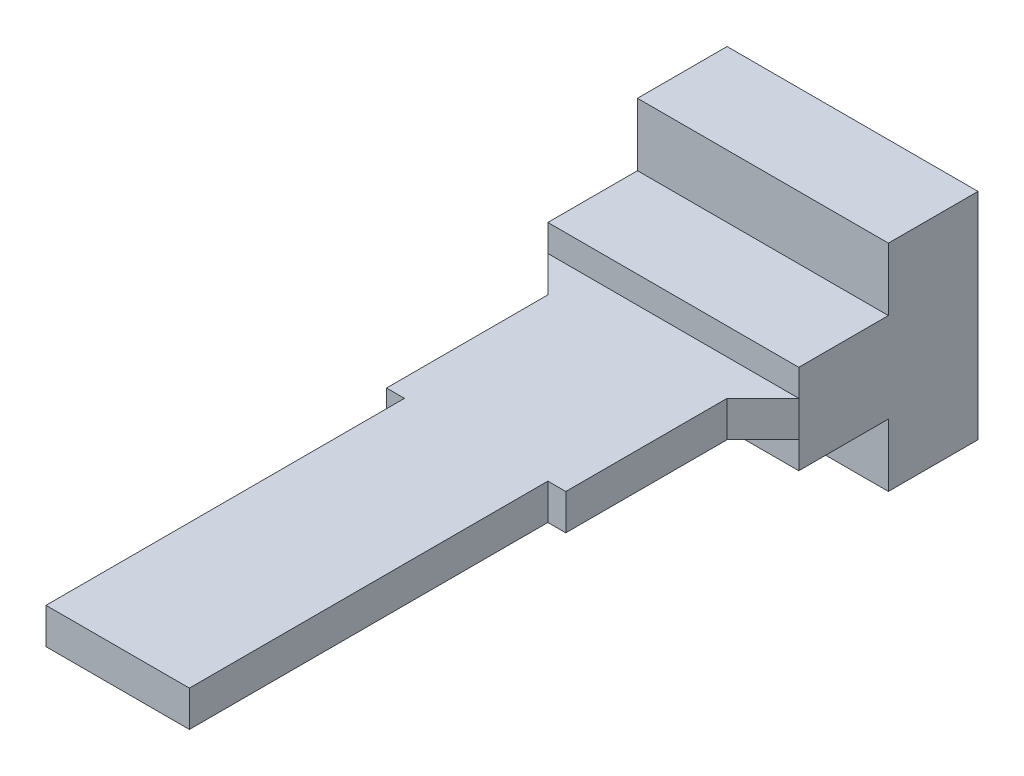
ISO-10303-21;
HEADER;
FILE_DESCRIPTION(('STEP AP214'),'2;1');
FILE_NAME('part.step','',(''),(''),'','','');
FILE_SCHEMA(('AUTOMOTIVE_DESIGN { 1 0 10303 214 1 1 1 1 }'));
ENDSEC;
DATA;
#1=APPLICATION_CONTEXT('core data for automotive mechanical design processes');
#2=APPLICATION_PROTOCOL_DEFINITION('international standard','automotive_design',2000,#1);
#3=PRODUCT_CONTEXT('',#1,'mechanical');
#4=PRODUCT('Part','Part','',(#3));
#5=PRODUCT_RELATED_PRODUCT_CATEGORY('part','',(#4));
#6=PRODUCT_DEFINITION_FORMATION('','',#4);
#7=PRODUCT_DEFINITION_CONTEXT('part definition',#1,'design');
#8=PRODUCT_DEFINITION('design','',#6,#7);
#9=PRODUCT_DEFINITION_SHAPE('','',#8);
#10=(LENGTH_UNIT() NAMED_UNIT(*) SI_UNIT(.MILLI.,.METRE.));
#11=(NAMED_UNIT(*) PLANE_ANGLE_UNIT() SI_UNIT($,.RADIAN.));
#12=(NAMED_UNIT(*) SI_UNIT($,.STERADIAN.) SOLID_ANGLE_UNIT());
#13=UNCERTAINTY_MEASURE_WITH_UNIT(LENGTH_MEASURE(1.E-05),#10,'distance_accuracy_value','');
#14=(GEOMETRIC_REPRESENTATION_CONTEXT(3) GLOBAL_UNCERTAINTY_ASSIGNED_CONTEXT((#13)) GLOBAL_UNIT_ASSIGNED_CONTEXT((#10,
#11,#12)) REPRESENTATION_CONTEXT('',''));
#15=CARTESIAN_POINT('',(0.,0.,0.));
#16=DIRECTION('',(0.,0.,1.));
#17=DIRECTION('',(1.,0.,0.));
#18=AXIS2_PLACEMENT_3D('',#15,#16,#17);
#19=CARTESIAN_POINT('',(0.,0.,10.5));
#20=DIRECTION('',(0.,0.,1.));
#21=DIRECTION('',(1.,0.,0.));
#22=AXIS2_PLACEMENT_3D('',#19,#20,#21);
#23=PLANE('',#22);
#24=DIRECTION('',(0.,-1.,0.));
#25=VECTOR('',#24,1.);
#26=CARTESIAN_POINT('',(-2.,-0.5,10.5));
#27=LINE('',#26,#25);
#28=CARTESIAN_POINT('',(-2.,0.5,10.5));
#29=VERTEX_POINT('',#28);
#30=CARTESIAN_POINT('',(-2.,-0.5,10.5));
#31=VERTEX_POINT('',#30);
#32=EDGE_CURVE('E55',#29,#31,#27,.T.);
#33=ORIENTED_EDGE('',*,*,#32,.F.);
#34=DIRECTION('',(-1.,0.,0.));
#35=VECTOR('',#34,1.);
#36=CARTESIAN_POINT('',(2.5,0.5,10.5));
#37=LINE('',#36,#35);
#38=CARTESIAN_POINT('',(-2.5,0.5,10.5));
#39=VERTEX_POINT('',#38);
#40=EDGE_CURVE('E211',#29,#39,#37,.T.);
#41=ORIENTED_EDGE('',*,*,#40,.T.);
#42=DIRECTION('',(0.,-1.,0.));
#43=VECTOR('',#42,1.);
#44=CARTESIAN_POINT('',(-2.5,-0.5,10.5));
#45=LINE('',#44,#43);
#46=CARTESIAN_POINT('',(-2.5,-0.5,10.5));
#47=VERTEX_POINT('',#46);
#48=EDGE_CURVE('E200',#39,#47,#45,.T.);
#49=ORIENTED_EDGE('',*,*,#48,.T.);
#50=DIRECTION('',(1.,0.,0.));
#51=VECTOR('',#50,1.);
#52=CARTESIAN_POINT('',(2.5,-0.5,10.5));
#53=LINE('',#52,#51);
#54=EDGE_CURVE('E205',#47,#31,#53,.T.);
#55=ORIENTED_EDGE('',*,*,#54,.T.);
#56=EDGE_LOOP('',(#33,#41,#49,#55));
#57=FACE_BOUND('',#56,.T.);
#58=ADVANCED_FACE('F39',(#57),#23,.T.);
#59=CARTESIAN_POINT('',(0.,0.,5.));
#60=DIRECTION('',(0.,0.,-1.));
#61=DIRECTION('',(-1.,0.,0.));
#62=AXIS2_PLACEMENT_3D('',#59,#60,#61);
#63=PLANE('',#62);
#64=DIRECTION('',(-1.,0.,0.));
#65=VECTOR('',#64,1.);
#66=CARTESIAN_POINT('',(3.5,0.5,5.));
#67=LINE('',#66,#65);
#68=CARTESIAN_POINT('',(3.5,0.5,5.));
#69=VERTEX_POINT('',#68);
#70=CARTESIAN_POINT('',(-3.5,0.5,5.));
#71=VERTEX_POINT('',#70);
#72=EDGE_CURVE('E237',#69,#71,#67,.T.);
#73=ORIENTED_EDGE('',*,*,#72,.F.);
#74=DIRECTION('',(0.,1.,0.));
#75=VECTOR('',#74,1.);
#76=CARTESIAN_POINT('',(3.5,-1.25,5.));
#77=LINE('',#76,#75);
#78=CARTESIAN_POINT('',(3.5,1.25,5.));
#79=VERTEX_POINT('',#78);
#80=EDGE_CURVE('E247',#69,#79,#77,.T.);
#81=ORIENTED_EDGE('',*,*,#80,.T.);
#82=DIRECTION('',(-1.,0.,0.));
#83=VECTOR('',#82,1.);
#84=CARTESIAN_POINT('',(-3.5,1.25,5.));
#85=LINE('',#84,#83);
#86=CARTESIAN_POINT('',(-3.5,1.25,5.));
#87=VERTEX_POINT('',#86);
#88=EDGE_CURVE('E246',#79,#87,#85,.T.);
#89=ORIENTED_EDGE('',*,*,#88,.T.);
#90=DIRECTION('',(0.,-1.,0.));
#91=VECTOR('',#90,1.);
#92=CARTESIAN_POINT('',(-3.5,-1.25,5.));
#93=LINE('',#92,#91);
#94=EDGE_CURVE('E251',#87,#71,#93,.T.);
#95=ORIENTED_EDGE('',*,*,#94,.T.);
#96=EDGE_LOOP('',(#73,#81,#89,#95));
#97=FACE_BOUND('',#96,.T.);
#98=ADVANCED_FACE('F354',(#97),#63,.F.);
#99=DIRECTION('',(1.,0.,0.));
#100=VECTOR('',#99,1.);
#101=CARTESIAN_POINT('',(3.5,-0.5,5.));
#102=LINE('',#101,#100);
#103=CARTESIAN_POINT('',(-3.5,-0.5,5.));
#104=VERTEX_POINT('',#103);
#105=CARTESIAN_POINT('',(3.5,-0.5,5.));
#106=VERTEX_POINT('',#105);
#107=EDGE_CURVE('E234',#104,#106,#102,.T.);
#108=ORIENTED_EDGE('',*,*,#107,.F.);
#109=CARTESIAN_POINT('',(-3.5,-1.25,5.));
#110=VERTEX_POINT('',#109);
#111=EDGE_CURVE('E250',#104,#110,#93,.T.);
#112=ORIENTED_EDGE('',*,*,#111,.T.);
#113=DIRECTION('',(1.,0.,0.));
#114=VECTOR('',#113,1.);
#115=CARTESIAN_POINT('',(-3.5,-1.25,5.));
#116=LINE('',#115,#114);
#117=CARTESIAN_POINT('',(3.5,-1.25,5.));
#118=VERTEX_POINT('',#117);
#119=EDGE_CURVE('E255',#110,#118,#116,.T.);
#120=ORIENTED_EDGE('',*,*,#119,.T.);
#121=EDGE_CURVE('E242',#118,#106,#77,.T.);
#122=ORIENTED_EDGE('',*,*,#121,.T.);
#123=EDGE_LOOP('',(#108,#112,#120,#122));
#124=FACE_BOUND('',#123,.T.);
#125=ADVANCED_FACE('F392',(#124),#63,.F.);
#126=CARTESIAN_POINT('',(0.,0.,2.5));
#127=DIRECTION('',(0.,0.,-1.));
#128=DIRECTION('',(-1.,0.,0.));
#129=AXIS2_PLACEMENT_3D('',#126,#127,#128);
#130=PLANE('',#129);
#131=DIRECTION('',(1.,0.,0.));
#132=VECTOR('',#131,1.);
#133=CARTESIAN_POINT('',(-3.5,-1.25,2.5));
#134=LINE('',#133,#132);
#135=CARTESIAN_POINT('',(-3.5,-1.25,2.5));
#136=VERTEX_POINT('',#135);
#137=CARTESIAN_POINT('',(3.5,-1.25,2.5));
#138=VERTEX_POINT('',#137);
#139=EDGE_CURVE('E262',#136,#138,#134,.T.);
#140=ORIENTED_EDGE('',*,*,#139,.F.);
#141=DIRECTION('',(0.,-1.,0.));
#142=VECTOR('',#141,1.);
#143=CARTESIAN_POINT('',(-3.5,-3.,2.5));
#144=LINE('',#143,#142);
#145=CARTESIAN_POINT('',(-3.5,-3.,2.5));
#146=VERTEX_POINT('',#145);
#147=EDGE_CURVE('E289',#136,#146,#144,.T.);
#148=ORIENTED_EDGE('',*,*,#147,.T.);
#149=DIRECTION('',(1.,0.,0.));
#150=VECTOR('',#149,1.);
#151=CARTESIAN_POINT('',(-3.5,-3.,2.5));
#152=LINE('',#151,#150);
#153=CARTESIAN_POINT('',(3.5,-3.,2.5));
#154=VERTEX_POINT('',#153);
#155=EDGE_CURVE('E293',#146,#154,#152,.T.);
#156=ORIENTED_EDGE('',*,*,#155,.T.);
#157=DIRECTION('',(0.,1.,0.));
#158=VECTOR('',#157,1.);
#159=CARTESIAN_POINT('',(3.5,-3.,2.5));
#160=LINE('',#159,#158);
#161=EDGE_CURVE('E282',#154,#138,#160,.T.);
#162=ORIENTED_EDGE('',*,*,#161,.T.);
#163=EDGE_LOOP('',(#140,#148,#156,#162));
#164=FACE_BOUND('',#163,.T.);
#165=ADVANCED_FACE('F434',(#164),#130,.F.);
#166=DIRECTION('',(-1.,0.,0.));
#167=VECTOR('',#166,1.);
#168=CARTESIAN_POINT('',(-3.5,1.25,2.5));
#169=LINE('',#168,#167);
#170=CARTESIAN_POINT('',(3.5,1.25,2.5));
#171=VERTEX_POINT('',#170);
#172=CARTESIAN_POINT('',(-3.5,1.25,2.5));
#173=VERTEX_POINT('',#172);
#174=EDGE_CURVE('E241',#171,#173,#169,.T.);
#175=ORIENTED_EDGE('',*,*,#174,.F.);
#176=CARTESIAN_POINT('',(3.5,3.,2.5));
#177=VERTEX_POINT('',#176);
#178=EDGE_CURVE('E286',#171,#177,#160,.T.);
#179=ORIENTED_EDGE('',*,*,#178,.T.);
#180=DIRECTION('',(-1.,0.,0.));
#181=VECTOR('',#180,1.);
#182=CARTESIAN_POINT('',(-3.5,3.,2.5));
#183=LINE('',#182,#181);
#184=CARTESIAN_POINT('',(-3.5,3.,2.5));
#185=VERTEX_POINT('',#184);
#186=EDGE_CURVE('E285',#177,#185,#183,.T.);
#187=ORIENTED_EDGE('',*,*,#186,.T.);
#188=EDGE_CURVE('E290',#185,#173,#144,.T.);
#189=ORIENTED_EDGE('',*,*,#188,.T.);
#190=EDGE_LOOP('',(#175,#179,#187,#189));
#191=FACE_BOUND('',#190,.T.);
#192=ADVANCED_FACE('F437',(#191),#130,.F.);
#193=CARTESIAN_POINT('',(3.5,-3.,2.5));
#194=DIRECTION('',(-1.,0.,0.));
#195=DIRECTION('',(0.,0.,1.));
#196=AXIS2_PLACEMENT_3D('',#193,#194,#195);
#197=PLANE('',#196);
#198=ORIENTED_EDGE('',*,*,#80,.F.);
#199=DIRECTION('',(0.,-1.,0.));
#200=VECTOR('',#199,1.);
#201=CARTESIAN_POINT('',(3.5,-0.5,5.));
#202=LINE('',#201,#200);
#203=EDGE_CURVE('E330',#69,#106,#202,.T.);
#204=ORIENTED_EDGE('',*,*,#203,.T.);
#205=ORIENTED_EDGE('',*,*,#121,.F.);
#206=DIRECTION('',(0.,0.,-1.));
#207=VECTOR('',#206,1.);
#208=CARTESIAN_POINT('',(3.5,-1.25,5.));
#209=LINE('',#208,#207);
#210=EDGE_CURVE('E258',#118,#138,#209,.T.);
#211=ORIENTED_EDGE('',*,*,#210,.T.);
#212=ORIENTED_EDGE('',*,*,#161,.F.);
#213=DIRECTION('',(0.,0.,-1.));
#214=VECTOR('',#213,1.);
#215=CARTESIAN_POINT('',(3.5,-3.,2.5));
#216=LINE('',#215,#214);
#217=CARTESIAN_POINT('',(3.5,-3.,0.));
#218=VERTEX_POINT('',#217);
#219=EDGE_CURVE('E296',#154,#218,#216,.T.);
#220=ORIENTED_EDGE('',*,*,#219,.T.);
#221=DIRECTION('',(0.,1.,0.));
#222=VECTOR('',#221,1.);
#223=CARTESIAN_POINT('',(3.5,-3.,0.));
#224=LINE('',#223,#222);
#225=CARTESIAN_POINT('',(3.5,3.,0.));
#226=VERTEX_POINT('',#225);
#227=EDGE_CURVE('E281',#218,#226,#224,.T.);
#228=ORIENTED_EDGE('',*,*,#227,.T.);
#229=DIRECTION('',(0.,0.,-1.));
#230=VECTOR('',#229,1.);
#231=CARTESIAN_POINT('',(3.5,3.,2.5));
#232=LINE('',#231,#230);
#233=EDGE_CURVE('E320',#177,#226,#232,.T.);
#234=ORIENTED_EDGE('',*,*,#233,.F.);
#235=ORIENTED_EDGE('',*,*,#178,.F.);
#236=DIRECTION('',(0.,0.,-1.));
#237=VECTOR('',#236,1.);
#238=CARTESIAN_POINT('',(3.5,1.25,5.));
#239=LINE('',#238,#237);
#240=EDGE_CURVE('E277',#79,#171,#239,.T.);
#241=ORIENTED_EDGE('',*,*,#240,.F.);
#242=EDGE_LOOP('',(#198,#204,#205,#211,#212,#220,#228,#234,#235,#241));
#243=FACE_BOUND('',#242,.T.);
#244=ADVANCED_FACE('F359',(#243),#197,.F.);
#245=CARTESIAN_POINT('',(-3.5,3.,2.5));
#246=DIRECTION('',(0.,-1.,0.));
#247=DIRECTION('',(0.,0.,-1.));
#248=AXIS2_PLACEMENT_3D('',#245,#246,#247);
#249=PLANE('',#248);
#250=DIRECTION('',(-1.,0.,0.));
#251=VECTOR('',#250,1.);
#252=CARTESIAN_POINT('',(-3.5,3.,0.));
#253=LINE('',#252,#251);
#254=CARTESIAN_POINT('',(-3.5,3.,0.));
#255=VERTEX_POINT('',#254);
#256=EDGE_CURVE('E300',#226,#255,#253,.T.);
#257=ORIENTED_EDGE('',*,*,#256,.T.);
#258=DIRECTION('',(0.,0.,-1.));
#259=VECTOR('',#258,1.);
#260=CARTESIAN_POINT('',(-3.5,3.,2.5));
#261=LINE('',#260,#259);
#262=EDGE_CURVE('E316',#185,#255,#261,.T.);
#263=ORIENTED_EDGE('',*,*,#262,.F.);
#264=ORIENTED_EDGE('',*,*,#186,.F.);
#265=ORIENTED_EDGE('',*,*,#233,.T.);
#266=EDGE_LOOP('',(#257,#263,#264,#265));
#267=FACE_BOUND('',#266,.T.);
#268=ADVANCED_FACE('F448',(#267),#249,.F.);
#269=CARTESIAN_POINT('',(-3.5,-3.,2.5));
#270=DIRECTION('',(1.,0.,0.));
#271=DIRECTION('',(0.,0.,-1.));
#272=AXIS2_PLACEMENT_3D('',#269,#270,#271);
#273=PLANE('',#272);
#274=ORIENTED_EDGE('',*,*,#111,.F.);
#275=DIRECTION('',(0.,1.,0.));
#276=VECTOR('',#275,1.);
#277=CARTESIAN_POINT('',(-3.5,0.5,5.));
#278=LINE('',#277,#276);
#279=EDGE_CURVE('E11',#104,#71,#278,.T.);
#280=ORIENTED_EDGE('',*,*,#279,.T.);
#281=ORIENTED_EDGE('',*,*,#94,.F.);
#282=DIRECTION('',(0.,0.,-1.));
#283=VECTOR('',#282,1.);
#284=CARTESIAN_POINT('',(-3.5,1.25,5.));
#285=LINE('',#284,#283);
#286=EDGE_CURVE('E273',#87,#173,#285,.T.);
#287=ORIENTED_EDGE('',*,*,#286,.T.);
#288=ORIENTED_EDGE('',*,*,#188,.F.);
#289=ORIENTED_EDGE('',*,*,#262,.T.);
#290=DIRECTION('',(0.,-1.,0.));
#291=VECTOR('',#290,1.);
#292=CARTESIAN_POINT('',(-3.5,-3.,0.));
#293=LINE('',#292,#291);
#294=CARTESIAN_POINT('',(-3.5,-3.,0.));
#295=VERTEX_POINT('',#294);
#296=EDGE_CURVE('E303',#255,#295,#293,.T.);
#297=ORIENTED_EDGE('',*,*,#296,.T.);
#298=DIRECTION('',(0.,0.,-1.));
#299=VECTOR('',#298,1.);
#300=CARTESIAN_POINT('',(-3.5,-3.,2.5));
#301=LINE('',#300,#299);
#302=EDGE_CURVE('E312',#146,#295,#301,.T.);
#303=ORIENTED_EDGE('',*,*,#302,.F.);
#304=ORIENTED_EDGE('',*,*,#147,.F.);
#305=DIRECTION('',(0.,0.,-1.));
#306=VECTOR('',#305,1.);
#307=CARTESIAN_POINT('',(-3.5,-1.25,5.));
#308=LINE('',#307,#306);
#309=EDGE_CURVE('E269',#110,#136,#308,.T.);
#310=ORIENTED_EDGE('',*,*,#309,.F.);
#311=EDGE_LOOP('',(#274,#280,#281,#287,#288,#289,#297,#303,#304,#310));
#312=FACE_BOUND('',#311,.T.);
#313=ADVANCED_FACE('F395',(#312),#273,.F.);
#314=CARTESIAN_POINT('',(-3.5,-3.,2.5));
#315=DIRECTION('',(0.,1.,0.));
#316=DIRECTION('',(0.,0.,1.));
#317=AXIS2_PLACEMENT_3D('',#314,#315,#316);
#318=PLANE('',#317);
#319=DIRECTION('',(1.,0.,0.));
#320=VECTOR('',#319,1.);
#321=CARTESIAN_POINT('',(-3.5,-3.,0.));
#322=LINE('',#321,#320);
#323=EDGE_CURVE('E306',#295,#218,#322,.T.);
#324=ORIENTED_EDGE('',*,*,#323,.T.);
#325=ORIENTED_EDGE('',*,*,#219,.F.);
#326=ORIENTED_EDGE('',*,*,#155,.F.);
#327=ORIENTED_EDGE('',*,*,#302,.T.);
#328=EDGE_LOOP('',(#324,#325,#326,#327));
#329=FACE_BOUND('',#328,.T.);
#330=ADVANCED_FACE('F441',(#329),#318,.F.);
#331=CARTESIAN_POINT('',(0.,0.,0.));
#332=DIRECTION('',(0.,0.,-1.));
#333=DIRECTION('',(-1.,0.,0.));
#334=AXIS2_PLACEMENT_3D('',#331,#332,#333);
#335=PLANE('',#334);
#336=ORIENTED_EDGE('',*,*,#227,.F.);
#337=ORIENTED_EDGE('',*,*,#323,.F.);
#338=ORIENTED_EDGE('',*,*,#296,.F.);
#339=ORIENTED_EDGE('',*,*,#256,.F.);
#340=EDGE_LOOP('',(#336,#337,#338,#339));
#341=FACE_BOUND('',#340,.T.);
#342=ADVANCED_FACE('F432',(#341),#335,.T.);
#343=CARTESIAN_POINT('',(-3.5,1.25,5.));
#344=DIRECTION('',(0.,-1.,0.));
#345=DIRECTION('',(0.,0.,-1.));
#346=AXIS2_PLACEMENT_3D('',#343,#344,#345);
#347=PLANE('',#346);
#348=ORIENTED_EDGE('',*,*,#174,.T.);
#349=ORIENTED_EDGE('',*,*,#286,.F.);
#350=ORIENTED_EDGE('',*,*,#88,.F.);
#351=ORIENTED_EDGE('',*,*,#240,.T.);
#352=EDGE_LOOP('',(#348,#349,#350,#351));
#353=FACE_BOUND('',#352,.T.);
#354=ADVANCED_FACE('F428',(#353),#347,.F.);
#355=CARTESIAN_POINT('',(-3.5,-1.25,5.));
#356=DIRECTION('',(0.,1.,0.));
#357=DIRECTION('',(0.,0.,1.));
#358=AXIS2_PLACEMENT_3D('',#355,#356,#357);
#359=PLANE('',#358);
#360=ORIENTED_EDGE('',*,*,#139,.T.);
#361=ORIENTED_EDGE('',*,*,#210,.F.);
#362=ORIENTED_EDGE('',*,*,#119,.F.);
#363=ORIENTED_EDGE('',*,*,#309,.T.);
#364=EDGE_LOOP('',(#360,#361,#362,#363));
#365=FACE_BOUND('',#364,.T.);
#366=ADVANCED_FACE('F424',(#365),#359,.F.);
#367=CARTESIAN_POINT('',(3.5,-0.5,6.));
#368=DIRECTION('',(0.,1.,0.));
#369=DIRECTION('',(0.,0.,1.));
#370=AXIS2_PLACEMENT_3D('',#367,#368,#369);
#371=PLANE('',#370);
#372=ORIENTED_EDGE('',*,*,#107,.T.);
#373=DIRECTION('',(-0.707106781186546,0.,0.707106781186549));
#374=VECTOR('',#373,1.);
#375=CARTESIAN_POINT('',(2.50000000000001,-0.5,6.));
#376=LINE('',#375,#374);
#377=CARTESIAN_POINT('',(2.5,-0.5,6.));
#378=VERTEX_POINT('',#377);
#379=EDGE_CURVE('E48',#106,#378,#376,.T.);
#380=ORIENTED_EDGE('',*,*,#379,.T.);
#381=DIRECTION('',(0.,0.,-1.));
#382=VECTOR('',#381,1.);
#383=CARTESIAN_POINT('',(2.5,-0.5,10.5));
#384=LINE('',#383,#382);
#385=CARTESIAN_POINT('',(2.5,-0.5,10.5));
#386=VERTEX_POINT('',#385);
#387=EDGE_CURVE('E226',#386,#378,#384,.T.);
#388=ORIENTED_EDGE('',*,*,#387,.F.);
#389=CARTESIAN_POINT('',(2.,-0.5,10.5));
#390=VERTEX_POINT('',#389);
#391=EDGE_CURVE('E204',#390,#386,#53,.T.);
#392=ORIENTED_EDGE('',*,*,#391,.F.);
#393=DIRECTION('',(0.,0.,-1.));
#394=VECTOR('',#393,1.);
#395=CARTESIAN_POINT('',(2.,-0.5,20.5));
#396=LINE('',#395,#394);
#397=CARTESIAN_POINT('',(2.,-0.5,20.5));
#398=VERTEX_POINT('',#397);
#399=EDGE_CURVE('E171',#398,#390,#396,.T.);
#400=ORIENTED_EDGE('',*,*,#399,.F.);
#401=DIRECTION('',(1.,0.,0.));
#402=VECTOR('',#401,1.);
#403=CARTESIAN_POINT('',(2.,-0.5,20.5));
#404=LINE('',#403,#402);
#405=CARTESIAN_POINT('',(-2.,-0.5,20.5));
#406=VERTEX_POINT('',#405);
#407=EDGE_CURVE('E164',#406,#398,#404,.T.);
#408=ORIENTED_EDGE('',*,*,#407,.F.);
#409=DIRECTION('',(0.,0.,-1.));
#410=VECTOR('',#409,1.);
#411=CARTESIAN_POINT('',(-2.,-0.5,20.5));
#412=LINE('',#411,#410);
#413=EDGE_CURVE('E169',#406,#31,#412,.T.);
#414=ORIENTED_EDGE('',*,*,#413,.T.);
#415=ORIENTED_EDGE('',*,*,#54,.F.);
#416=DIRECTION('',(0.,0.,-1.));
#417=VECTOR('',#416,1.);
#418=CARTESIAN_POINT('',(-2.5,-0.5,10.5));
#419=LINE('',#418,#417);
#420=CARTESIAN_POINT('',(-2.5,-0.5,6.));
#421=VERTEX_POINT('',#420);
#422=EDGE_CURVE('E230',#47,#421,#419,.T.);
#423=ORIENTED_EDGE('',*,*,#422,.T.);
#424=DIRECTION('',(-0.707106781186546,0.,-0.707106781186549));
#425=VECTOR('',#424,1.);
#426=CARTESIAN_POINT('',(-2.50000000000001,-0.5,6.));
#427=LINE('',#426,#425);
#428=EDGE_CURVE('E333',#421,#104,#427,.T.);
#429=ORIENTED_EDGE('',*,*,#428,.T.);
#430=EDGE_LOOP('',(#372,#380,#388,#392,#400,#408,#414,#415,#423,#429));
#431=FACE_BOUND('',#430,.T.);
#432=ADVANCED_FACE('F167',(#431),#371,.F.);
#433=CARTESIAN_POINT('',(3.5,0.5,6.));
#434=DIRECTION('',(0.,-1.,0.));
#435=DIRECTION('',(0.,0.,-1.));
#436=AXIS2_PLACEMENT_3D('',#433,#434,#435);
#437=PLANE('',#436);
#438=DIRECTION('',(0.,0.,-1.));
#439=VECTOR('',#438,1.);
#440=CARTESIAN_POINT('',(2.5,0.5,10.5));
#441=LINE('',#440,#439);
#442=CARTESIAN_POINT('',(2.5,0.5,10.5));
#443=VERTEX_POINT('',#442);
#444=CARTESIAN_POINT('',(2.5,0.5,6.));
#445=VERTEX_POINT('',#444);
#446=EDGE_CURVE('E222',#443,#445,#441,.T.);
#447=ORIENTED_EDGE('',*,*,#446,.T.);
#448=DIRECTION('',(0.707106781186546,0.,-0.707106781186549));
#449=VECTOR('',#448,1.);
#450=CARTESIAN_POINT('',(2.50000000000001,0.5,6.));
#451=LINE('',#450,#449);
#452=EDGE_CURVE('E327',#445,#69,#451,.T.);
#453=ORIENTED_EDGE('',*,*,#452,.T.);
#454=ORIENTED_EDGE('',*,*,#72,.T.);
#455=DIRECTION('',(0.707106781186546,0.,0.707106781186549));
#456=VECTOR('',#455,1.);
#457=CARTESIAN_POINT('',(-2.50000000000001,0.5,6.));
#458=LINE('',#457,#456);
#459=CARTESIAN_POINT('',(-2.5,0.5,6.));
#460=VERTEX_POINT('',#459);
#461=EDGE_CURVE('E324',#71,#460,#458,.T.);
#462=ORIENTED_EDGE('',*,*,#461,.T.);
#463=DIRECTION('',(0.,0.,-1.));
#464=VECTOR('',#463,1.);
#465=CARTESIAN_POINT('',(-2.5,0.5,10.5));
#466=LINE('',#465,#464);
#467=EDGE_CURVE('E214',#39,#460,#466,.T.);
#468=ORIENTED_EDGE('',*,*,#467,.F.);
#469=ORIENTED_EDGE('',*,*,#40,.F.);
#470=DIRECTION('',(0.,0.,-1.));
#471=VECTOR('',#470,1.);
#472=CARTESIAN_POINT('',(-2.,0.5,20.5));
#473=LINE('',#472,#471);
#474=CARTESIAN_POINT('',(-2.,0.5,20.5));
#475=VERTEX_POINT('',#474);
#476=EDGE_CURVE('E373',#475,#29,#473,.T.);
#477=ORIENTED_EDGE('',*,*,#476,.F.);
#478=DIRECTION('',(-1.,0.,0.));
#479=VECTOR('',#478,1.);
#480=CARTESIAN_POINT('',(2.,0.5,20.5));
#481=LINE('',#480,#479);
#482=CARTESIAN_POINT('',(2.,0.5,20.5));
#483=VERTEX_POINT('',#482);
#484=EDGE_CURVE('E181',#483,#475,#481,.T.);
#485=ORIENTED_EDGE('',*,*,#484,.F.);
#486=DIRECTION('',(0.,0.,-1.));
#487=VECTOR('',#486,1.);
#488=CARTESIAN_POINT('',(2.,0.5,20.5));
#489=LINE('',#488,#487);
#490=CARTESIAN_POINT('',(2.,0.5,10.5));
#491=VERTEX_POINT('',#490);
#492=EDGE_CURVE('E196',#483,#491,#489,.T.);
#493=ORIENTED_EDGE('',*,*,#492,.T.);
#494=EDGE_CURVE('E212',#443,#491,#37,.T.);
#495=ORIENTED_EDGE('',*,*,#494,.F.);
#496=EDGE_LOOP('',(#447,#453,#454,#462,#468,#469,#477,#485,#493,#495));
#497=FACE_BOUND('',#496,.T.);
#498=ADVANCED_FACE('F349',(#497),#437,.F.);
#499=CARTESIAN_POINT('',(-2.5,-0.5,10.5));
#500=DIRECTION('',(1.,0.,0.));
#501=DIRECTION('',(0.,0.,-1.));
#502=AXIS2_PLACEMENT_3D('',#499,#500,#501);
#503=PLANE('',#502);
#504=DIRECTION('',(0.,-1.,0.));
#505=VECTOR('',#504,1.);
#506=CARTESIAN_POINT('',(-2.5,-0.5,6.));
#507=LINE('',#506,#505);
#508=EDGE_CURVE('E189',#460,#421,#507,.T.);
#509=ORIENTED_EDGE('',*,*,#508,.T.);
#510=ORIENTED_EDGE('',*,*,#422,.F.);
#511=ORIENTED_EDGE('',*,*,#48,.F.);
#512=ORIENTED_EDGE('',*,*,#467,.T.);
#513=EDGE_LOOP('',(#509,#510,#511,#512));
#514=FACE_BOUND('',#513,.T.);
#515=ADVANCED_FACE('F386',(#514),#503,.F.);
#516=CARTESIAN_POINT('',(2.5,-0.5,10.5));
#517=DIRECTION('',(-1.,0.,0.));
#518=DIRECTION('',(0.,0.,1.));
#519=AXIS2_PLACEMENT_3D('',#516,#517,#518);
#520=PLANE('',#519);
#521=DIRECTION('',(0.,1.,0.));
#522=VECTOR('',#521,1.);
#523=CARTESIAN_POINT('',(2.5,-0.5,6.));
#524=LINE('',#523,#522);
#525=EDGE_CURVE('E194',#378,#445,#524,.T.);
#526=ORIENTED_EDGE('',*,*,#525,.T.);
#527=ORIENTED_EDGE('',*,*,#446,.F.);
#528=DIRECTION('',(0.,1.,0.));
#529=VECTOR('',#528,1.);
#530=CARTESIAN_POINT('',(2.5,-0.5,10.5));
#531=LINE('',#530,#529);
#532=EDGE_CURVE('E208',#386,#443,#531,.T.);
#533=ORIENTED_EDGE('',*,*,#532,.F.);
#534=ORIENTED_EDGE('',*,*,#387,.T.);
#535=EDGE_LOOP('',(#526,#527,#533,#534));
#536=FACE_BOUND('',#535,.T.);
#537=ADVANCED_FACE('F344',(#536),#520,.F.);
#538=DIRECTION('',(0.,1.,0.));
#539=VECTOR('',#538,1.);
#540=CARTESIAN_POINT('',(2.,-0.5,10.5));
#541=LINE('',#540,#539);
#542=EDGE_CURVE('E63',#390,#491,#541,.T.);
#543=ORIENTED_EDGE('',*,*,#542,.F.);
#544=ORIENTED_EDGE('',*,*,#391,.T.);
#545=ORIENTED_EDGE('',*,*,#532,.T.);
#546=ORIENTED_EDGE('',*,*,#494,.T.);
#547=EDGE_LOOP('',(#543,#544,#545,#546));
#548=FACE_BOUND('',#547,.T.);
#549=ADVANCED_FACE('F365',(#548),#23,.T.);
#550=CARTESIAN_POINT('',(-2.,-0.5,20.5));
#551=DIRECTION('',(1.,0.,0.));
#552=DIRECTION('',(0.,0.,-1.));
#553=AXIS2_PLACEMENT_3D('',#550,#551,#552);
#554=PLANE('',#553);
#555=ORIENTED_EDGE('',*,*,#32,.T.);
#556=ORIENTED_EDGE('',*,*,#413,.F.);
#557=DIRECTION('',(0.,-1.,0.));
#558=VECTOR('',#557,1.);
#559=CARTESIAN_POINT('',(-2.,-0.5,20.5));
#560=LINE('',#559,#558);
#561=EDGE_CURVE('E176',#475,#406,#560,.T.);
#562=ORIENTED_EDGE('',*,*,#561,.F.);
#563=ORIENTED_EDGE('',*,*,#476,.T.);
#564=EDGE_LOOP('',(#555,#556,#562,#563));
#565=FACE_BOUND('',#564,.T.);
#566=ADVANCED_FACE('F187',(#565),#554,.F.);
#567=CARTESIAN_POINT('',(2.,-0.5,20.5));
#568=DIRECTION('',(-1.,0.,0.));
#569=DIRECTION('',(0.,0.,1.));
#570=AXIS2_PLACEMENT_3D('',#567,#568,#569);
#571=PLANE('',#570);
#572=ORIENTED_EDGE('',*,*,#542,.T.);
#573=ORIENTED_EDGE('',*,*,#492,.F.);
#574=DIRECTION('',(0.,1.,0.));
#575=VECTOR('',#574,1.);
#576=CARTESIAN_POINT('',(2.,-0.5,20.5));
#577=LINE('',#576,#575);
#578=EDGE_CURVE('E175',#398,#483,#577,.T.);
#579=ORIENTED_EDGE('',*,*,#578,.F.);
#580=ORIENTED_EDGE('',*,*,#399,.T.);
#581=EDGE_LOOP('',(#572,#573,#579,#580));
#582=FACE_BOUND('',#581,.T.);
#583=ADVANCED_FACE('F367',(#582),#571,.F.);
#584=CARTESIAN_POINT('',(0.,0.,20.5));
#585=DIRECTION('',(0.,0.,1.));
#586=DIRECTION('',(1.,0.,0.));
#587=AXIS2_PLACEMENT_3D('',#584,#585,#586);
#588=PLANE('',#587);
#589=ORIENTED_EDGE('',*,*,#561,.T.);
#590=ORIENTED_EDGE('',*,*,#407,.T.);
#591=ORIENTED_EDGE('',*,*,#578,.T.);
#592=ORIENTED_EDGE('',*,*,#484,.T.);
#593=EDGE_LOOP('',(#589,#590,#591,#592));
#594=FACE_BOUND('',#593,.T.);
#595=ADVANCED_FACE('F179',(#594),#588,.T.);
#596=CARTESIAN_POINT('',(2.50000000000001,0.,6.));
#597=DIRECTION('',(0.707106781186549,0.,0.707106781186546));
#598=DIRECTION('',(0.,-1.,0.));
#599=AXIS2_PLACEMENT_3D('',#596,#597,#598);
#600=PLANE('',#599);
#601=ORIENTED_EDGE('',*,*,#379,.F.);
#602=ORIENTED_EDGE('',*,*,#203,.F.);
#603=ORIENTED_EDGE('',*,*,#452,.F.);
#604=ORIENTED_EDGE('',*,*,#525,.F.);
#605=EDGE_LOOP('',(#601,#602,#603,#604));
#606=FACE_BOUND('',#605,.T.);
#607=ADVANCED_FACE('F346',(#606),#600,.T.);
#608=CARTESIAN_POINT('',(-2.50000000000001,0.,6.));
#609=DIRECTION('',(-0.707106781186549,0.,0.707106781186546));
#610=DIRECTION('',(0.,1.,0.));
#611=AXIS2_PLACEMENT_3D('',#608,#609,#610);
#612=PLANE('',#611);
#613=ORIENTED_EDGE('',*,*,#461,.F.);
#614=ORIENTED_EDGE('',*,*,#279,.F.);
#615=ORIENTED_EDGE('',*,*,#428,.F.);
#616=ORIENTED_EDGE('',*,*,#508,.F.);
#617=EDGE_LOOP('',(#613,#614,#615,#616));
#618=FACE_BOUND('',#617,.T.);
#619=ADVANCED_FACE('F41',(#618),#612,.T.);
#620=CLOSED_SHELL('',(#58,#98,#125,#165,#192,#244,#268,#313,#330,#342,#354,#366,#432,#498,#515,
#537,#549,#566,#583,#595,#607,#619));
#621=MANIFOLD_SOLID_BREP('B2',#620);
#622=ADVANCED_BREP_SHAPE_REPRESENTATION('',(#18,#621),#14);
#623=SHAPE_DEFINITION_REPRESENTATION(#9,#622);
ENDSEC;
END-ISO-10303-21;
